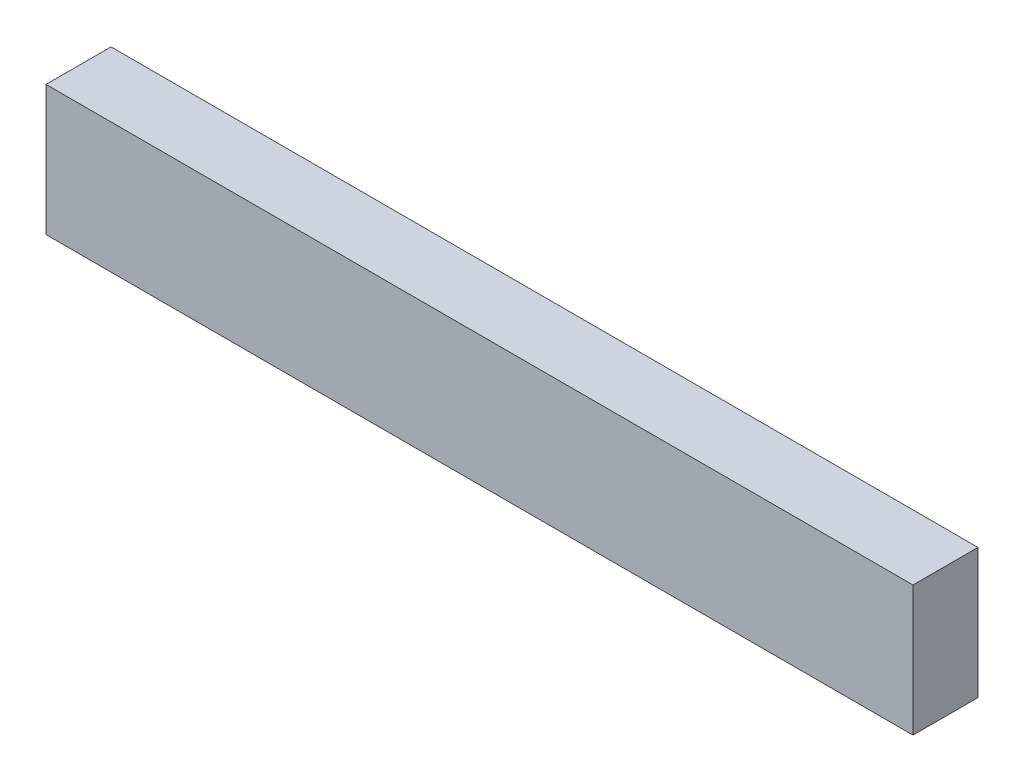
ISO-10303-21;
HEADER;
FILE_DESCRIPTION(('STEP AP214'),'2;1');
FILE_NAME('part.step','',(''),(''),'','','');
FILE_SCHEMA(('AUTOMOTIVE_DESIGN { 1 0 10303 214 1 1 1 1 }'));
ENDSEC;
DATA;
#1=APPLICATION_CONTEXT('core data for automotive mechanical design processes');
#2=APPLICATION_PROTOCOL_DEFINITION('international standard','automotive_design',2000,#1);
#3=PRODUCT_CONTEXT('',#1,'mechanical');
#4=PRODUCT('Part','Part','',(#3));
#5=PRODUCT_RELATED_PRODUCT_CATEGORY('part','',(#4));
#6=PRODUCT_DEFINITION_FORMATION('','',#4);
#7=PRODUCT_DEFINITION_CONTEXT('part definition',#1,'design');
#8=PRODUCT_DEFINITION('design','',#6,#7);
#9=PRODUCT_DEFINITION_SHAPE('','',#8);
#10=(LENGTH_UNIT() NAMED_UNIT(*) SI_UNIT(.MILLI.,.METRE.));
#11=(NAMED_UNIT(*) PLANE_ANGLE_UNIT() SI_UNIT($,.RADIAN.));
#12=(NAMED_UNIT(*) SI_UNIT($,.STERADIAN.) SOLID_ANGLE_UNIT());
#13=UNCERTAINTY_MEASURE_WITH_UNIT(LENGTH_MEASURE(1.E-05),#10,'distance_accuracy_value','');
#14=(GEOMETRIC_REPRESENTATION_CONTEXT(3) GLOBAL_UNCERTAINTY_ASSIGNED_CONTEXT((#13)) GLOBAL_UNIT_ASSIGNED_CONTEXT((#10,
#11,#12)) REPRESENTATION_CONTEXT('',''));
#15=CARTESIAN_POINT('',(0.,0.,0.));
#16=DIRECTION('',(0.,0.,1.));
#17=DIRECTION('',(1.,0.,0.));
#18=AXIS2_PLACEMENT_3D('',#15,#16,#17);
#19=CARTESIAN_POINT('',(40.,12.,-3.));
#20=DIRECTION('',(-1.,0.,0.));
#21=DIRECTION('',(0.,0.,1.));
#22=AXIS2_PLACEMENT_3D('',#19,#20,#21);
#23=PLANE('',#22);
#24=DIRECTION('',(0.,0.,-1.));
#25=VECTOR('',#24,1.);
#26=CARTESIAN_POINT('',(40.,0.,-3.));
#27=LINE('',#26,#25);
#28=CARTESIAN_POINT('',(40.,0.,3.));
#29=VERTEX_POINT('',#28);
#30=CARTESIAN_POINT('',(40.,0.,-3.));
#31=VERTEX_POINT('',#30);
#32=EDGE_CURVE('E98',#29,#31,#27,.T.);
#33=ORIENTED_EDGE('',*,*,#32,.T.);
#34=DIRECTION('',(0.,-1.,0.));
#35=VECTOR('',#34,1.);
#36=CARTESIAN_POINT('',(40.,12.,-3.));
#37=LINE('',#36,#35);
#38=CARTESIAN_POINT('',(40.,12.,-3.));
#39=VERTEX_POINT('',#38);
#40=EDGE_CURVE('E11',#39,#31,#37,.T.);
#41=ORIENTED_EDGE('',*,*,#40,.F.);
#42=DIRECTION('',(0.,0.,-1.));
#43=VECTOR('',#42,1.);
#44=CARTESIAN_POINT('',(40.,12.,-3.));
#45=LINE('',#44,#43);
#46=CARTESIAN_POINT('',(40.,12.,3.));
#47=VERTEX_POINT('',#46);
#48=EDGE_CURVE('E86',#47,#39,#45,.T.);
#49=ORIENTED_EDGE('',*,*,#48,.F.);
#50=DIRECTION('',(0.,-1.,0.));
#51=VECTOR('',#50,1.);
#52=CARTESIAN_POINT('',(40.,12.,3.));
#53=LINE('',#52,#51);
#54=EDGE_CURVE('E94',#47,#29,#53,.T.);
#55=ORIENTED_EDGE('',*,*,#54,.T.);
#56=EDGE_LOOP('',(#33,#41,#49,#55));
#57=FACE_BOUND('',#56,.T.);
#58=ADVANCED_FACE('F35',(#57),#23,.F.);
#59=CARTESIAN_POINT('',(-40.,12.,-3.));
#60=DIRECTION('',(0.,0.,1.));
#61=DIRECTION('',(1.,0.,0.));
#62=AXIS2_PLACEMENT_3D('',#59,#60,#61);
#63=PLANE('',#62);
#64=DIRECTION('',(-1.,0.,0.));
#65=VECTOR('',#64,1.);
#66=CARTESIAN_POINT('',(-40.,0.,-3.));
#67=LINE('',#66,#65);
#68=CARTESIAN_POINT('',(-40.,0.,-3.));
#69=VERTEX_POINT('',#68);
#70=EDGE_CURVE('E90',#31,#69,#67,.T.);
#71=ORIENTED_EDGE('',*,*,#70,.T.);
#72=DIRECTION('',(0.,-1.,0.));
#73=VECTOR('',#72,1.);
#74=CARTESIAN_POINT('',(-40.,12.,-3.));
#75=LINE('',#74,#73);
#76=CARTESIAN_POINT('',(-40.,12.,-3.));
#77=VERTEX_POINT('',#76);
#78=EDGE_CURVE('E43',#77,#69,#75,.T.);
#79=ORIENTED_EDGE('',*,*,#78,.F.);
#80=DIRECTION('',(-1.,0.,0.));
#81=VECTOR('',#80,1.);
#82=CARTESIAN_POINT('',(-40.,12.,-3.));
#83=LINE('',#82,#81);
#84=EDGE_CURVE('E81',#39,#77,#83,.T.);
#85=ORIENTED_EDGE('',*,*,#84,.F.);
#86=ORIENTED_EDGE('',*,*,#40,.T.);
#87=EDGE_LOOP('',(#71,#79,#85,#86));
#88=FACE_BOUND('',#87,.T.);
#89=ADVANCED_FACE('F89',(#88),#63,.F.);
#90=CARTESIAN_POINT('',(-40.,12.,-3.));
#91=DIRECTION('',(1.,0.,0.));
#92=DIRECTION('',(0.,0.,-1.));
#93=AXIS2_PLACEMENT_3D('',#90,#91,#92);
#94=PLANE('',#93);
#95=DIRECTION('',(0.,0.,1.));
#96=VECTOR('',#95,1.);
#97=CARTESIAN_POINT('',(-40.,0.,-3.));
#98=LINE('',#97,#96);
#99=CARTESIAN_POINT('',(-40.,0.,3.));
#100=VERTEX_POINT('',#99);
#101=EDGE_CURVE('E68',#69,#100,#98,.T.);
#102=ORIENTED_EDGE('',*,*,#101,.T.);
#103=DIRECTION('',(0.,-1.,0.));
#104=VECTOR('',#103,1.);
#105=CARTESIAN_POINT('',(-40.,12.,3.));
#106=LINE('',#105,#104);
#107=CARTESIAN_POINT('',(-40.,12.,3.));
#108=VERTEX_POINT('',#107);
#109=EDGE_CURVE('E91',#108,#100,#106,.T.);
#110=ORIENTED_EDGE('',*,*,#109,.F.);
#111=DIRECTION('',(0.,0.,1.));
#112=VECTOR('',#111,1.);
#113=CARTESIAN_POINT('',(-40.,12.,-3.));
#114=LINE('',#113,#112);
#115=EDGE_CURVE('E84',#77,#108,#114,.T.);
#116=ORIENTED_EDGE('',*,*,#115,.F.);
#117=ORIENTED_EDGE('',*,*,#78,.T.);
#118=EDGE_LOOP('',(#102,#110,#116,#117));
#119=FACE_BOUND('',#118,.T.);
#120=ADVANCED_FACE('F92',(#119),#94,.F.);
#121=CARTESIAN_POINT('',(-40.,12.,3.));
#122=DIRECTION('',(0.,0.,-1.));
#123=DIRECTION('',(-1.,0.,0.));
#124=AXIS2_PLACEMENT_3D('',#121,#122,#123);
#125=PLANE('',#124);
#126=DIRECTION('',(1.,0.,0.));
#127=VECTOR('',#126,1.);
#128=CARTESIAN_POINT('',(-40.,0.,3.));
#129=LINE('',#128,#127);
#130=EDGE_CURVE('E74',#100,#29,#129,.T.);
#131=ORIENTED_EDGE('',*,*,#130,.T.);
#132=ORIENTED_EDGE('',*,*,#54,.F.);
#133=DIRECTION('',(1.,0.,0.));
#134=VECTOR('',#133,1.);
#135=CARTESIAN_POINT('',(-40.,12.,3.));
#136=LINE('',#135,#134);
#137=EDGE_CURVE('E51',#108,#47,#136,.T.);
#138=ORIENTED_EDGE('',*,*,#137,.F.);
#139=ORIENTED_EDGE('',*,*,#109,.T.);
#140=EDGE_LOOP('',(#131,#132,#138,#139));
#141=FACE_BOUND('',#140,.T.);
#142=ADVANCED_FACE('F105',(#141),#125,.F.);
#143=CARTESIAN_POINT('',(0.,12.,0.));
#144=DIRECTION('',(0.,1.,0.));
#145=DIRECTION('',(0.,0.,1.));
#146=AXIS2_PLACEMENT_3D('',#143,#144,#145);
#147=PLANE('',#146);
#148=ORIENTED_EDGE('',*,*,#48,.T.);
#149=ORIENTED_EDGE('',*,*,#84,.T.);
#150=ORIENTED_EDGE('',*,*,#115,.T.);
#151=ORIENTED_EDGE('',*,*,#137,.T.);
#152=EDGE_LOOP('',(#148,#149,#150,#151));
#153=FACE_BOUND('',#152,.T.);
#154=ADVANCED_FACE('F82',(#153),#147,.T.);
#155=CARTESIAN_POINT('',(0.,0.,0.));
#156=DIRECTION('',(0.,1.,0.));
#157=DIRECTION('',(0.,0.,1.));
#158=AXIS2_PLACEMENT_3D('',#155,#156,#157);
#159=PLANE('',#158);
#160=ORIENTED_EDGE('',*,*,#32,.F.);
#161=ORIENTED_EDGE('',*,*,#130,.F.);
#162=ORIENTED_EDGE('',*,*,#101,.F.);
#163=ORIENTED_EDGE('',*,*,#70,.F.);
#164=EDGE_LOOP('',(#160,#161,#162,#163));
#165=FACE_BOUND('',#164,.T.);
#166=ADVANCED_FACE('F108',(#165),#159,.F.);
#167=CLOSED_SHELL('',(#58,#89,#120,#142,#154,#166));
#168=MANIFOLD_SOLID_BREP('B2',#167);
#169=ADVANCED_BREP_SHAPE_REPRESENTATION('',(#18,#168),#14);
#170=SHAPE_DEFINITION_REPRESENTATION(#9,#169);
ENDSEC;
END-ISO-10303-21;
